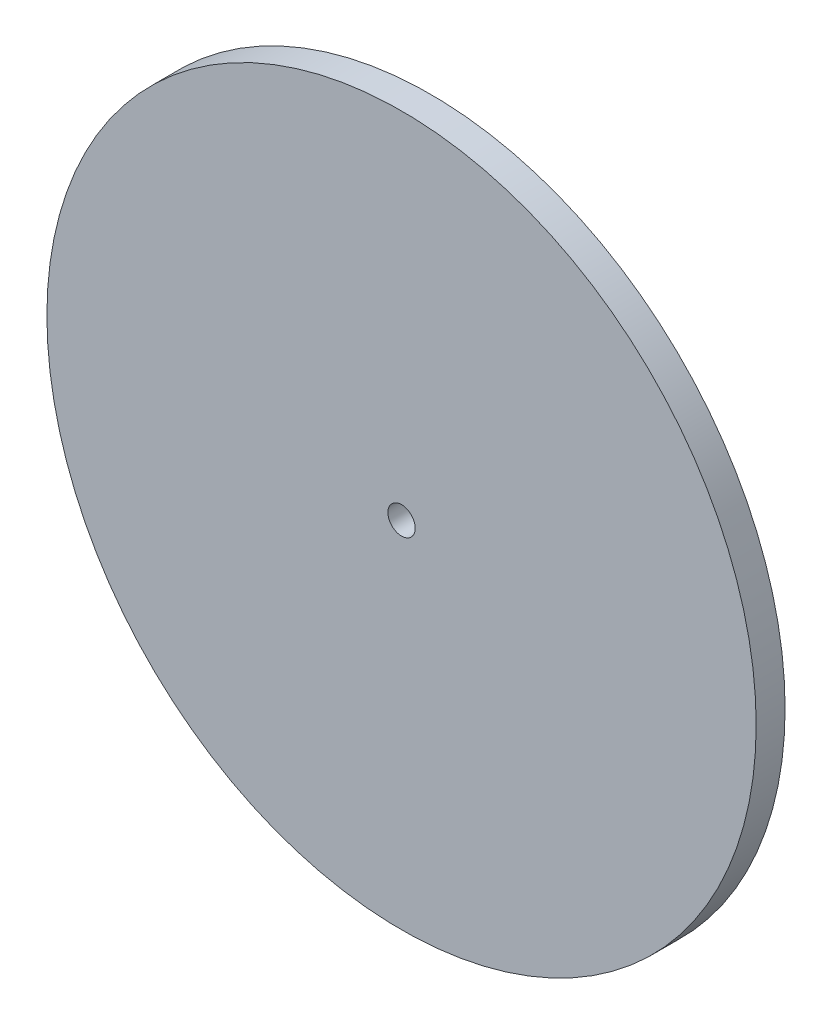
ISO-10303-21;
HEADER;
FILE_DESCRIPTION(('STEP AP214'),'2;1');
FILE_NAME('part.step','',(''),(''),'','','');
FILE_SCHEMA(('AUTOMOTIVE_DESIGN { 1 0 10303 214 1 1 1 1 }'));
ENDSEC;
DATA;
#1=APPLICATION_CONTEXT('core data for automotive mechanical design processes');
#2=APPLICATION_PROTOCOL_DEFINITION('international standard','automotive_design',2000,#1);
#3=PRODUCT_CONTEXT('',#1,'mechanical');
#4=PRODUCT('Part','Part','',(#3));
#5=PRODUCT_RELATED_PRODUCT_CATEGORY('part','',(#4));
#6=PRODUCT_DEFINITION_FORMATION('','',#4);
#7=PRODUCT_DEFINITION_CONTEXT('part definition',#1,'design');
#8=PRODUCT_DEFINITION('design','',#6,#7);
#9=PRODUCT_DEFINITION_SHAPE('','',#8);
#10=(LENGTH_UNIT() NAMED_UNIT(*) SI_UNIT(.MILLI.,.METRE.));
#11=(NAMED_UNIT(*) PLANE_ANGLE_UNIT() SI_UNIT($,.RADIAN.));
#12=(NAMED_UNIT(*) SI_UNIT($,.STERADIAN.) SOLID_ANGLE_UNIT());
#13=UNCERTAINTY_MEASURE_WITH_UNIT(LENGTH_MEASURE(1.E-05),#10,'distance_accuracy_value','');
#14=(GEOMETRIC_REPRESENTATION_CONTEXT(3) GLOBAL_UNCERTAINTY_ASSIGNED_CONTEXT((#13)) GLOBAL_UNIT_ASSIGNED_CONTEXT((#10,
#11,#12)) REPRESENTATION_CONTEXT('',''));
#15=CARTESIAN_POINT('',(0.,0.,0.));
#16=DIRECTION('',(0.,0.,1.));
#17=DIRECTION('',(1.,0.,0.));
#18=AXIS2_PLACEMENT_3D('',#15,#16,#17);
#19=CARTESIAN_POINT('',(0.,0.,5.3));
#20=DIRECTION('',(0.,0.,1.));
#21=DIRECTION('',(1.,0.,0.));
#22=AXIS2_PLACEMENT_3D('',#19,#20,#21);
#23=PLANE('',#22);
#24=CARTESIAN_POINT('',(0.,0.,5.3));
#25=DIRECTION('',(0.,0.,1.));
#26=DIRECTION('',(1.,0.,0.));
#27=AXIS2_PLACEMENT_3D('',#24,#25,#26);
#28=CIRCLE('',#27,2.5);
#29=CARTESIAN_POINT('',(2.5,0.,5.3));
#30=VERTEX_POINT('',#29);
#31=EDGE_CURVE('E23',#30,#30,#28,.T.);
#32=ORIENTED_EDGE('',*,*,#31,.F.);
#33=EDGE_LOOP('',(#32));
#34=FACE_BOUND('',#33,.T.);
#35=CARTESIAN_POINT('',(0.,0.,5.3));
#36=DIRECTION('',(0.,0.,1.));
#37=DIRECTION('',(1.,0.,0.));
#38=AXIS2_PLACEMENT_3D('',#35,#36,#37);
#39=CIRCLE('',#38,65.);
#40=CARTESIAN_POINT('',(65.,0.,5.3));
#41=VERTEX_POINT('',#40);
#42=EDGE_CURVE('E56',#41,#41,#39,.T.);
#43=ORIENTED_EDGE('',*,*,#42,.T.);
#44=EDGE_LOOP('',(#43));
#45=FACE_BOUND('',#44,.T.);
#46=ADVANCED_FACE('F15',(#34,#45),#23,.T.);
#47=CARTESIAN_POINT('',(0.,0.,0.));
#48=DIRECTION('',(0.,0.,1.));
#49=DIRECTION('',(1.,0.,0.));
#50=AXIS2_PLACEMENT_3D('',#47,#48,#49);
#51=PLANE('',#50);
#52=CARTESIAN_POINT('',(0.,0.,0.));
#53=DIRECTION('',(0.,0.,1.));
#54=DIRECTION('',(1.,0.,0.));
#55=AXIS2_PLACEMENT_3D('',#52,#53,#54);
#56=CIRCLE('',#55,2.5);
#57=CARTESIAN_POINT('',(2.5,0.,0.));
#58=VERTEX_POINT('',#57);
#59=EDGE_CURVE('E10',#58,#58,#56,.T.);
#60=ORIENTED_EDGE('',*,*,#59,.T.);
#61=EDGE_LOOP('',(#60));
#62=FACE_BOUND('',#61,.T.);
#63=CARTESIAN_POINT('',(0.,0.,0.));
#64=DIRECTION('',(0.,0.,1.));
#65=DIRECTION('',(1.,0.,0.));
#66=AXIS2_PLACEMENT_3D('',#63,#64,#65);
#67=CIRCLE('',#66,65.);
#68=CARTESIAN_POINT('',(65.,0.,0.));
#69=VERTEX_POINT('',#68);
#70=EDGE_CURVE('E55',#69,#69,#67,.T.);
#71=ORIENTED_EDGE('',*,*,#70,.F.);
#72=EDGE_LOOP('',(#71));
#73=FACE_BOUND('',#72,.T.);
#74=ADVANCED_FACE('F88',(#62,#73),#51,.F.);
#75=CARTESIAN_POINT('',(0.,0.,0.));
#76=DIRECTION('',(0.,0.,-1.));
#77=DIRECTION('',(1.,0.,0.));
#78=AXIS2_PLACEMENT_3D('',#75,#76,#77);
#79=CYLINDRICAL_SURFACE('',#78,2.5);
#80=DIRECTION('',(0.,0.,1.));
#81=VECTOR('',#80,1.);
#82=CARTESIAN_POINT('',(2.5,0.,0.));
#83=LINE('',#82,#81);
#84=EDGE_CURVE('E62',#58,#30,#83,.T.);
#85=ORIENTED_EDGE('',*,*,#84,.T.);
#86=ORIENTED_EDGE('',*,*,#31,.T.);
#87=ORIENTED_EDGE('',*,*,#84,.F.);
#88=ORIENTED_EDGE('',*,*,#59,.F.);
#89=EDGE_LOOP('',(#85,#86,#87,#88));
#90=FACE_BOUND('',#89,.T.);
#91=ADVANCED_FACE('F78',(#90),#79,.F.);
#92=CARTESIAN_POINT('',(0.,0.,0.));
#93=DIRECTION('',(0.,0.,-1.));
#94=DIRECTION('',(1.,0.,0.));
#95=AXIS2_PLACEMENT_3D('',#92,#93,#94);
#96=CYLINDRICAL_SURFACE('',#95,65.);
#97=ORIENTED_EDGE('',*,*,#70,.T.);
#98=DIRECTION('',(0.,0.,1.));
#99=VECTOR('',#98,1.);
#100=CARTESIAN_POINT('',(65.,0.,0.));
#101=LINE('',#100,#99);
#102=EDGE_CURVE('E52',#69,#41,#101,.T.);
#103=ORIENTED_EDGE('',*,*,#102,.T.);
#104=ORIENTED_EDGE('',*,*,#42,.F.);
#105=ORIENTED_EDGE('',*,*,#102,.F.);
#106=EDGE_LOOP('',(#97,#103,#104,#105));
#107=FACE_BOUND('',#106,.T.);
#108=ADVANCED_FACE('F53',(#107),#96,.T.);
#109=CLOSED_SHELL('',(#46,#74,#91,#108));
#110=MANIFOLD_SOLID_BREP('B1',#109);
#111=ADVANCED_BREP_SHAPE_REPRESENTATION('',(#18,#110),#14);
#112=SHAPE_DEFINITION_REPRESENTATION(#9,#111);
ENDSEC;
END-ISO-10303-21;
